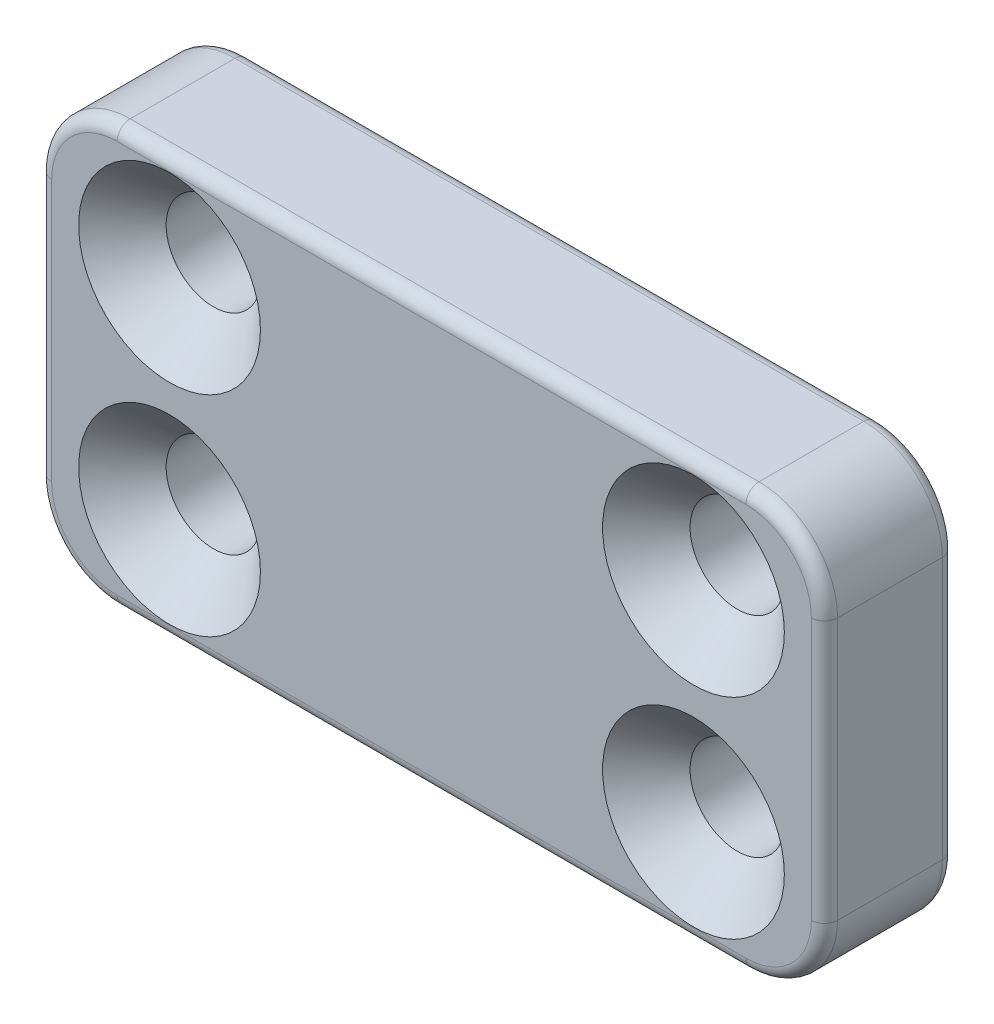
ISO-10303-21;
HEADER;
FILE_DESCRIPTION(('STEP AP214'),'2;1');
FILE_NAME('part.step','',(''),(''),'','','');
FILE_SCHEMA(('AUTOMOTIVE_DESIGN { 1 0 10303 214 1 1 1 1 }'));
ENDSEC;
DATA;
#1=APPLICATION_CONTEXT('core data for automotive mechanical design processes');
#2=APPLICATION_PROTOCOL_DEFINITION('international standard','automotive_design',2000,#1);
#3=PRODUCT_CONTEXT('',#1,'mechanical');
#4=PRODUCT('Part','Part','',(#3));
#5=PRODUCT_RELATED_PRODUCT_CATEGORY('part','',(#4));
#6=PRODUCT_DEFINITION_FORMATION('','',#4);
#7=PRODUCT_DEFINITION_CONTEXT('part definition',#1,'design');
#8=PRODUCT_DEFINITION('design','',#6,#7);
#9=PRODUCT_DEFINITION_SHAPE('','',#8);
#10=(LENGTH_UNIT() NAMED_UNIT(*) SI_UNIT(.MILLI.,.METRE.));
#11=(NAMED_UNIT(*) PLANE_ANGLE_UNIT() SI_UNIT($,.RADIAN.));
#12=(NAMED_UNIT(*) SI_UNIT($,.STERADIAN.) SOLID_ANGLE_UNIT());
#13=UNCERTAINTY_MEASURE_WITH_UNIT(LENGTH_MEASURE(1.E-05),#10,'distance_accuracy_value','');
#14=(GEOMETRIC_REPRESENTATION_CONTEXT(3) GLOBAL_UNCERTAINTY_ASSIGNED_CONTEXT((#13)) GLOBAL_UNIT_ASSIGNED_CONTEXT((#10,
#11,#12)) REPRESENTATION_CONTEXT('',''));
#15=CARTESIAN_POINT('',(0.,0.,0.));
#16=DIRECTION('',(0.,0.,1.));
#17=DIRECTION('',(1.,0.,0.));
#18=AXIS2_PLACEMENT_3D('',#15,#16,#17);
#19=CARTESIAN_POINT('',(0.,0.,5.));
#20=DIRECTION('',(0.,0.,-1.));
#21=DIRECTION('',(-1.,0.,0.));
#22=AXIS2_PLACEMENT_3D('',#19,#20,#21);
#23=PLANE('',#22);
#24=DIRECTION('',(0.,1.,0.));
#25=VECTOR('',#24,1.);
#26=CARTESIAN_POINT('',(29.5,0.,5.));
#27=LINE('',#26,#25);
#28=CARTESIAN_POINT('',(29.5,3.,5.));
#29=VERTEX_POINT('',#28);
#30=CARTESIAN_POINT('',(29.5,13.,5.));
#31=VERTEX_POINT('',#30);
#32=EDGE_CURVE('E173',#29,#31,#27,.T.);
#33=ORIENTED_EDGE('',*,*,#32,.T.);
#34=CARTESIAN_POINT('',(27.,13.,5.));
#35=DIRECTION('',(0.,0.,-1.));
#36=DIRECTION('',(-1.,0.,0.));
#37=AXIS2_PLACEMENT_3D('',#34,#35,#36);
#38=CIRCLE('',#37,2.5);
#39=CARTESIAN_POINT('',(27.,15.5,5.));
#40=VERTEX_POINT('',#39);
#41=EDGE_CURVE('E154',#31,#40,#38,.F.);
#42=ORIENTED_EDGE('',*,*,#41,.T.);
#43=DIRECTION('',(-1.,0.,0.));
#44=VECTOR('',#43,1.);
#45=CARTESIAN_POINT('',(0.,15.5,5.));
#46=LINE('',#45,#44);
#47=CARTESIAN_POINT('',(3.,15.5,5.));
#48=VERTEX_POINT('',#47);
#49=EDGE_CURVE('E162',#40,#48,#46,.T.);
#50=ORIENTED_EDGE('',*,*,#49,.T.);
#51=CARTESIAN_POINT('',(3.,13.,5.));
#52=DIRECTION('',(0.,0.,-1.));
#53=DIRECTION('',(-1.,0.,0.));
#54=AXIS2_PLACEMENT_3D('',#51,#52,#53);
#55=CIRCLE('',#54,2.5);
#56=CARTESIAN_POINT('',(0.5,13.,5.));
#57=VERTEX_POINT('',#56);
#58=EDGE_CURVE('E168',#48,#57,#55,.F.);
#59=ORIENTED_EDGE('',*,*,#58,.T.);
#60=DIRECTION('',(0.,-1.,0.));
#61=VECTOR('',#60,1.);
#62=CARTESIAN_POINT('',(0.5,0.,5.));
#63=LINE('',#62,#61);
#64=CARTESIAN_POINT('',(0.5,3.,5.));
#65=VERTEX_POINT('',#64);
#66=EDGE_CURVE('E305',#57,#65,#63,.T.);
#67=ORIENTED_EDGE('',*,*,#66,.T.);
#68=CARTESIAN_POINT('',(3.,3.,5.));
#69=DIRECTION('',(0.,0.,-1.));
#70=DIRECTION('',(-1.,0.,0.));
#71=AXIS2_PLACEMENT_3D('',#68,#69,#70);
#72=CIRCLE('',#71,2.5);
#73=CARTESIAN_POINT('',(3.,0.5,5.));
#74=VERTEX_POINT('',#73);
#75=EDGE_CURVE('E307',#65,#74,#72,.F.);
#76=ORIENTED_EDGE('',*,*,#75,.T.);
#77=DIRECTION('',(1.,0.,0.));
#78=VECTOR('',#77,1.);
#79=CARTESIAN_POINT('',(0.,0.5,5.));
#80=LINE('',#79,#78);
#81=CARTESIAN_POINT('',(27.,0.5,5.));
#82=VERTEX_POINT('',#81);
#83=EDGE_CURVE('E309',#74,#82,#80,.T.);
#84=ORIENTED_EDGE('',*,*,#83,.T.);
#85=CARTESIAN_POINT('',(27.,3.,5.));
#86=DIRECTION('',(0.,0.,-1.));
#87=DIRECTION('',(-1.,0.,0.));
#88=AXIS2_PLACEMENT_3D('',#85,#86,#87);
#89=CIRCLE('',#88,2.5);
#90=EDGE_CURVE('E179',#82,#29,#89,.F.);
#91=ORIENTED_EDGE('',*,*,#90,.T.);
#92=EDGE_LOOP('',(#33,#42,#50,#59,#67,#76,#84,#91));
#93=FACE_BOUND('',#92,.T.);
#94=CARTESIAN_POINT('',(5.00000000000008,4.,5.));
#95=DIRECTION('',(0.,0.,1.));
#96=DIRECTION('',(1.,0.,0.));
#97=AXIS2_PLACEMENT_3D('',#94,#95,#96);
#98=CIRCLE('',#97,3.47);
#99=CARTESIAN_POINT('',(8.47000000000009,4.,5.));
#100=VERTEX_POINT('',#99);
#101=EDGE_CURVE('E336',#100,#100,#98,.T.);
#102=ORIENTED_EDGE('',*,*,#101,.F.);
#103=EDGE_LOOP('',(#102));
#104=FACE_BOUND('',#103,.T.);
#105=CARTESIAN_POINT('',(25.0000000000001,4.,5.));
#106=DIRECTION('',(0.,0.,1.));
#107=DIRECTION('',(1.,0.,0.));
#108=AXIS2_PLACEMENT_3D('',#105,#106,#107);
#109=CIRCLE('',#108,3.47);
#110=CARTESIAN_POINT('',(28.4700000000001,4.,5.));
#111=VERTEX_POINT('',#110);
#112=EDGE_CURVE('E345',#111,#111,#109,.T.);
#113=ORIENTED_EDGE('',*,*,#112,.F.);
#114=EDGE_LOOP('',(#113));
#115=FACE_BOUND('',#114,.T.);
#116=CARTESIAN_POINT('',(25.,12.,5.));
#117=DIRECTION('',(0.,0.,1.));
#118=DIRECTION('',(1.,0.,0.));
#119=AXIS2_PLACEMENT_3D('',#116,#117,#118);
#120=CIRCLE('',#119,3.47);
#121=CARTESIAN_POINT('',(28.47,12.,5.));
#122=VERTEX_POINT('',#121);
#123=EDGE_CURVE('E354',#122,#122,#120,.T.);
#124=ORIENTED_EDGE('',*,*,#123,.F.);
#125=EDGE_LOOP('',(#124));
#126=FACE_BOUND('',#125,.T.);
#127=CARTESIAN_POINT('',(5.,12.,5.));
#128=DIRECTION('',(0.,0.,1.));
#129=DIRECTION('',(1.,0.,0.));
#130=AXIS2_PLACEMENT_3D('',#127,#128,#129);
#131=CIRCLE('',#130,3.47);
#132=CARTESIAN_POINT('',(8.47,12.,5.));
#133=VERTEX_POINT('',#132);
#134=EDGE_CURVE('E241',#133,#133,#131,.T.);
#135=ORIENTED_EDGE('',*,*,#134,.F.);
#136=EDGE_LOOP('',(#135));
#137=FACE_BOUND('',#136,.T.);
#138=ADVANCED_FACE('F33',(#93,#104,#115,#126,#137),#23,.F.);
#139=CARTESIAN_POINT('',(0.,0.,5.));
#140=DIRECTION('',(1.,0.,0.));
#141=DIRECTION('',(0.,0.,-1.));
#142=AXIS2_PLACEMENT_3D('',#139,#140,#141);
#143=PLANE('',#142);
#144=DIRECTION('',(0.,0.,-1.));
#145=VECTOR('',#144,1.);
#146=CARTESIAN_POINT('',(0.,3.,5.));
#147=LINE('',#146,#145);
#148=CARTESIAN_POINT('',(0.,3.,0.5));
#149=VERTEX_POINT('',#148);
#150=CARTESIAN_POINT('',(0.,3.,4.5));
#151=VERTEX_POINT('',#150);
#152=EDGE_CURVE('E169',#149,#151,#147,.F.);
#153=ORIENTED_EDGE('',*,*,#152,.T.);
#154=DIRECTION('',(0.,-1.,0.));
#155=VECTOR('',#154,1.);
#156=CARTESIAN_POINT('',(0.,0.,4.5));
#157=LINE('',#156,#155);
#158=CARTESIAN_POINT('',(0.,13.,4.5));
#159=VERTEX_POINT('',#158);
#160=EDGE_CURVE('E202',#151,#159,#157,.F.);
#161=ORIENTED_EDGE('',*,*,#160,.T.);
#162=DIRECTION('',(0.,0.,-1.));
#163=VECTOR('',#162,1.);
#164=CARTESIAN_POINT('',(0.,13.,5.));
#165=LINE('',#164,#163);
#166=CARTESIAN_POINT('',(0.,13.,0.5));
#167=VERTEX_POINT('',#166);
#168=EDGE_CURVE('E300',#159,#167,#165,.T.);
#169=ORIENTED_EDGE('',*,*,#168,.T.);
#170=DIRECTION('',(0.,-1.,0.));
#171=VECTOR('',#170,1.);
#172=CARTESIAN_POINT('',(0.,3.,0.5));
#173=LINE('',#172,#171);
#174=EDGE_CURVE('E200',#167,#149,#173,.T.);
#175=ORIENTED_EDGE('',*,*,#174,.T.);
#176=EDGE_LOOP('',(#153,#161,#169,#175));
#177=FACE_BOUND('',#176,.T.);
#178=ADVANCED_FACE('F369',(#177),#143,.F.);
#179=CARTESIAN_POINT('',(0.,0.,5.));
#180=DIRECTION('',(0.,1.,0.));
#181=DIRECTION('',(0.,0.,1.));
#182=AXIS2_PLACEMENT_3D('',#179,#180,#181);
#183=PLANE('',#182);
#184=DIRECTION('',(0.,0.,-1.));
#185=VECTOR('',#184,1.);
#186=CARTESIAN_POINT('',(27.,0.,5.));
#187=LINE('',#186,#185);
#188=CARTESIAN_POINT('',(27.,0.,0.5));
#189=VERTEX_POINT('',#188);
#190=CARTESIAN_POINT('',(27.,0.,4.5));
#191=VERTEX_POINT('',#190);
#192=EDGE_CURVE('E285',#189,#191,#187,.F.);
#193=ORIENTED_EDGE('',*,*,#192,.T.);
#194=DIRECTION('',(1.,0.,0.));
#195=VECTOR('',#194,1.);
#196=CARTESIAN_POINT('',(0.,0.,4.5));
#197=LINE('',#196,#195);
#198=CARTESIAN_POINT('',(3.,0.,4.5));
#199=VERTEX_POINT('',#198);
#200=EDGE_CURVE('E194',#191,#199,#197,.F.);
#201=ORIENTED_EDGE('',*,*,#200,.T.);
#202=DIRECTION('',(0.,0.,-1.));
#203=VECTOR('',#202,1.);
#204=CARTESIAN_POINT('',(3.,0.,5.));
#205=LINE('',#204,#203);
#206=CARTESIAN_POINT('',(3.,0.,0.5));
#207=VERTEX_POINT('',#206);
#208=EDGE_CURVE('E277',#199,#207,#205,.T.);
#209=ORIENTED_EDGE('',*,*,#208,.T.);
#210=DIRECTION('',(1.,0.,0.));
#211=VECTOR('',#210,1.);
#212=CARTESIAN_POINT('',(27.,0.,0.5));
#213=LINE('',#212,#211);
#214=EDGE_CURVE('E192',#207,#189,#213,.T.);
#215=ORIENTED_EDGE('',*,*,#214,.T.);
#216=EDGE_LOOP('',(#193,#201,#209,#215));
#217=FACE_BOUND('',#216,.T.);
#218=ADVANCED_FACE('F282',(#217),#183,.F.);
#219=CARTESIAN_POINT('',(30.,0.,5.));
#220=DIRECTION('',(-1.,0.,0.));
#221=DIRECTION('',(0.,0.,1.));
#222=AXIS2_PLACEMENT_3D('',#219,#220,#221);
#223=PLANE('',#222);
#224=DIRECTION('',(0.,0.,-1.));
#225=VECTOR('',#224,1.);
#226=CARTESIAN_POINT('',(30.,13.,5.));
#227=LINE('',#226,#225);
#228=CARTESIAN_POINT('',(30.,13.,0.5));
#229=VERTEX_POINT('',#228);
#230=CARTESIAN_POINT('',(30.,13.,4.5));
#231=VERTEX_POINT('',#230);
#232=EDGE_CURVE('E291',#229,#231,#227,.F.);
#233=ORIENTED_EDGE('',*,*,#232,.T.);
#234=DIRECTION('',(0.,1.,0.));
#235=VECTOR('',#234,1.);
#236=CARTESIAN_POINT('',(30.,0.,4.5));
#237=LINE('',#236,#235);
#238=CARTESIAN_POINT('',(30.,3.,4.5));
#239=VERTEX_POINT('',#238);
#240=EDGE_CURVE('E186',#231,#239,#237,.F.);
#241=ORIENTED_EDGE('',*,*,#240,.T.);
#242=DIRECTION('',(0.,0.,-1.));
#243=VECTOR('',#242,1.);
#244=CARTESIAN_POINT('',(30.,3.,5.));
#245=LINE('',#244,#243);
#246=CARTESIAN_POINT('',(30.,3.,0.5));
#247=VERTEX_POINT('',#246);
#248=EDGE_CURVE('E286',#239,#247,#245,.T.);
#249=ORIENTED_EDGE('',*,*,#248,.T.);
#250=DIRECTION('',(0.,1.,0.));
#251=VECTOR('',#250,1.);
#252=CARTESIAN_POINT('',(30.,13.,0.5));
#253=LINE('',#252,#251);
#254=EDGE_CURVE('E184',#247,#229,#253,.T.);
#255=ORIENTED_EDGE('',*,*,#254,.T.);
#256=EDGE_LOOP('',(#233,#241,#249,#255));
#257=FACE_BOUND('',#256,.T.);
#258=ADVANCED_FACE('F327',(#257),#223,.F.);
#259=CARTESIAN_POINT('',(0.,16.,5.));
#260=DIRECTION('',(0.,-1.,0.));
#261=DIRECTION('',(0.,0.,-1.));
#262=AXIS2_PLACEMENT_3D('',#259,#260,#261);
#263=PLANE('',#262);
#264=DIRECTION('',(0.,0.,-1.));
#265=VECTOR('',#264,1.);
#266=CARTESIAN_POINT('',(3.,16.,5.));
#267=LINE('',#266,#265);
#268=CARTESIAN_POINT('',(3.,16.,0.5));
#269=VERTEX_POINT('',#268);
#270=CARTESIAN_POINT('',(3.,16.,4.5));
#271=VERTEX_POINT('',#270);
#272=EDGE_CURVE('E288',#269,#271,#267,.F.);
#273=ORIENTED_EDGE('',*,*,#272,.T.);
#274=DIRECTION('',(-1.,0.,0.));
#275=VECTOR('',#274,1.);
#276=CARTESIAN_POINT('',(0.,16.,4.5));
#277=LINE('',#276,#275);
#278=CARTESIAN_POINT('',(27.,16.,4.5));
#279=VERTEX_POINT('',#278);
#280=EDGE_CURVE('E11',#271,#279,#277,.F.);
#281=ORIENTED_EDGE('',*,*,#280,.T.);
#282=DIRECTION('',(0.,0.,-1.));
#283=VECTOR('',#282,1.);
#284=CARTESIAN_POINT('',(27.,16.,5.));
#285=LINE('',#284,#283);
#286=CARTESIAN_POINT('',(27.,16.,0.5));
#287=VERTEX_POINT('',#286);
#288=EDGE_CURVE('E297',#279,#287,#285,.T.);
#289=ORIENTED_EDGE('',*,*,#288,.T.);
#290=DIRECTION('',(-1.,0.,0.));
#291=VECTOR('',#290,1.);
#292=CARTESIAN_POINT('',(3.,16.,0.5));
#293=LINE('',#292,#291);
#294=EDGE_CURVE('E42',#287,#269,#293,.T.);
#295=ORIENTED_EDGE('',*,*,#294,.T.);
#296=EDGE_LOOP('',(#273,#281,#289,#295));
#297=FACE_BOUND('',#296,.T.);
#298=ADVANCED_FACE('F383',(#297),#263,.F.);
#299=CARTESIAN_POINT('',(0.,0.,0.));
#300=DIRECTION('',(0.,0.,-1.));
#301=DIRECTION('',(-1.,0.,0.));
#302=AXIS2_PLACEMENT_3D('',#299,#300,#301);
#303=PLANE('',#302);
#304=DIRECTION('',(-1.,0.,0.));
#305=VECTOR('',#304,1.);
#306=CARTESIAN_POINT('',(27.,15.5,0.));
#307=LINE('',#306,#305);
#308=CARTESIAN_POINT('',(3.,15.5,0.));
#309=VERTEX_POINT('',#308);
#310=CARTESIAN_POINT('',(27.,15.5,0.));
#311=VERTEX_POINT('',#310);
#312=EDGE_CURVE('E208',#309,#311,#307,.F.);
#313=ORIENTED_EDGE('',*,*,#312,.T.);
#314=CARTESIAN_POINT('',(27.,13.,0.));
#315=DIRECTION('',(0.,0.,-1.));
#316=DIRECTION('',(-1.,0.,0.));
#317=AXIS2_PLACEMENT_3D('',#314,#315,#316);
#318=CIRCLE('',#317,2.5);
#319=CARTESIAN_POINT('',(29.5,13.,0.));
#320=VERTEX_POINT('',#319);
#321=EDGE_CURVE('E221',#311,#320,#318,.T.);
#322=ORIENTED_EDGE('',*,*,#321,.T.);
#323=DIRECTION('',(0.,1.,0.));
#324=VECTOR('',#323,1.);
#325=CARTESIAN_POINT('',(29.5,3.,0.));
#326=LINE('',#325,#324);
#327=CARTESIAN_POINT('',(29.5,3.,0.));
#328=VERTEX_POINT('',#327);
#329=EDGE_CURVE('E57',#320,#328,#326,.F.);
#330=ORIENTED_EDGE('',*,*,#329,.T.);
#331=CARTESIAN_POINT('',(27.,3.,0.));
#332=DIRECTION('',(0.,0.,-1.));
#333=DIRECTION('',(-1.,0.,0.));
#334=AXIS2_PLACEMENT_3D('',#331,#332,#333);
#335=CIRCLE('',#334,2.5);
#336=CARTESIAN_POINT('',(27.,0.5,0.));
#337=VERTEX_POINT('',#336);
#338=EDGE_CURVE('E218',#328,#337,#335,.T.);
#339=ORIENTED_EDGE('',*,*,#338,.T.);
#340=DIRECTION('',(1.,0.,0.));
#341=VECTOR('',#340,1.);
#342=CARTESIAN_POINT('',(3.,0.5,0.));
#343=LINE('',#342,#341);
#344=CARTESIAN_POINT('',(3.,0.5,0.));
#345=VERTEX_POINT('',#344);
#346=EDGE_CURVE('E216',#337,#345,#343,.F.);
#347=ORIENTED_EDGE('',*,*,#346,.T.);
#348=CARTESIAN_POINT('',(3.,3.,0.));
#349=DIRECTION('',(0.,0.,-1.));
#350=DIRECTION('',(-1.,0.,0.));
#351=AXIS2_PLACEMENT_3D('',#348,#349,#350);
#352=CIRCLE('',#351,2.5);
#353=CARTESIAN_POINT('',(0.5,3.,0.));
#354=VERTEX_POINT('',#353);
#355=EDGE_CURVE('E214',#345,#354,#352,.T.);
#356=ORIENTED_EDGE('',*,*,#355,.T.);
#357=DIRECTION('',(0.,-1.,0.));
#358=VECTOR('',#357,1.);
#359=CARTESIAN_POINT('',(0.5,13.,0.));
#360=LINE('',#359,#358);
#361=CARTESIAN_POINT('',(0.5,13.,0.));
#362=VERTEX_POINT('',#361);
#363=EDGE_CURVE('E212',#354,#362,#360,.F.);
#364=ORIENTED_EDGE('',*,*,#363,.T.);
#365=CARTESIAN_POINT('',(3.,13.,0.));
#366=DIRECTION('',(0.,0.,-1.));
#367=DIRECTION('',(-1.,0.,0.));
#368=AXIS2_PLACEMENT_3D('',#365,#366,#367);
#369=CIRCLE('',#368,2.5);
#370=EDGE_CURVE('E210',#362,#309,#369,.T.);
#371=ORIENTED_EDGE('',*,*,#370,.T.);
#372=EDGE_LOOP('',(#313,#322,#330,#339,#347,#356,#364,#371));
#373=FACE_BOUND('',#372,.T.);
#374=CARTESIAN_POINT('',(5.,12.,0.));
#375=DIRECTION('',(0.,0.,-1.));
#376=DIRECTION('',(-1.,0.,0.));
#377=AXIS2_PLACEMENT_3D('',#374,#375,#376);
#378=CIRCLE('',#377,1.8);
#379=CARTESIAN_POINT('',(3.2,12.,0.));
#380=VERTEX_POINT('',#379);
#381=EDGE_CURVE('E357',#380,#380,#378,.T.);
#382=ORIENTED_EDGE('',*,*,#381,.F.);
#383=EDGE_LOOP('',(#382));
#384=FACE_BOUND('',#383,.T.);
#385=CARTESIAN_POINT('',(25.,12.,0.));
#386=DIRECTION('',(0.,0.,-1.));
#387=DIRECTION('',(-1.,0.,0.));
#388=AXIS2_PLACEMENT_3D('',#385,#386,#387);
#389=CIRCLE('',#388,1.8);
#390=CARTESIAN_POINT('',(23.2,12.,0.));
#391=VERTEX_POINT('',#390);
#392=EDGE_CURVE('E348',#391,#391,#389,.T.);
#393=ORIENTED_EDGE('',*,*,#392,.F.);
#394=EDGE_LOOP('',(#393));
#395=FACE_BOUND('',#394,.T.);
#396=CARTESIAN_POINT('',(25.0000000000001,4.,0.));
#397=DIRECTION('',(0.,0.,-1.));
#398=DIRECTION('',(-1.,0.,0.));
#399=AXIS2_PLACEMENT_3D('',#396,#397,#398);
#400=CIRCLE('',#399,1.8);
#401=CARTESIAN_POINT('',(23.2000000000001,4.,0.));
#402=VERTEX_POINT('',#401);
#403=EDGE_CURVE('E339',#402,#402,#400,.T.);
#404=ORIENTED_EDGE('',*,*,#403,.F.);
#405=EDGE_LOOP('',(#404));
#406=FACE_BOUND('',#405,.T.);
#407=CARTESIAN_POINT('',(5.00000000000008,4.,0.));
#408=DIRECTION('',(0.,0.,-1.));
#409=DIRECTION('',(-1.,0.,0.));
#410=AXIS2_PLACEMENT_3D('',#407,#408,#409);
#411=CIRCLE('',#410,1.8);
#412=CARTESIAN_POINT('',(3.20000000000008,4.,0.));
#413=VERTEX_POINT('',#412);
#414=EDGE_CURVE('E329',#413,#413,#411,.T.);
#415=ORIENTED_EDGE('',*,*,#414,.F.);
#416=EDGE_LOOP('',(#415));
#417=FACE_BOUND('',#416,.T.);
#418=ADVANCED_FACE('F380',(#373,#384,#395,#406,#417),#303,.T.);
#419=CARTESIAN_POINT('',(5.00000000000008,4.,5.));
#420=DIRECTION('',(0.,0.,1.));
#421=DIRECTION('',(1.,0.,0.));
#422=AXIS2_PLACEMENT_3D('',#419,#420,#421);
#423=CYLINDRICAL_SURFACE('',#422,1.8);
#424=CARTESIAN_POINT('',(5.00000000000008,4.,3.33));
#425=DIRECTION('',(0.,0.,1.));
#426=DIRECTION('',(1.,0.,0.));
#427=AXIS2_PLACEMENT_3D('',#424,#425,#426);
#428=CIRCLE('',#427,1.8);
#429=CARTESIAN_POINT('',(6.80000000000008,4.,3.33));
#430=VERTEX_POINT('',#429);
#431=EDGE_CURVE('E331',#430,#430,#428,.T.);
#432=ORIENTED_EDGE('',*,*,#431,.T.);
#433=EDGE_LOOP('',(#432));
#434=FACE_BOUND('',#433,.T.);
#435=ORIENTED_EDGE('',*,*,#414,.T.);
#436=EDGE_LOOP('',(#435));
#437=FACE_BOUND('',#436,.T.);
#438=ADVANCED_FACE('F378',(#434,#437),#423,.F.);
#439=CARTESIAN_POINT('',(5.00000000000008,4.,5.));
#440=DIRECTION('',(0.,0.,1.));
#441=DIRECTION('',(1.,0.,0.));
#442=AXIS2_PLACEMENT_3D('',#439,#440,#441);
#443=CONICAL_SURFACE('',#442,3.47,0.785398163397449);
#444=ORIENTED_EDGE('',*,*,#431,.F.);
#445=EDGE_LOOP('',(#444));
#446=FACE_BOUND('',#445,.T.);
#447=ORIENTED_EDGE('',*,*,#101,.T.);
#448=EDGE_LOOP('',(#447));
#449=FACE_BOUND('',#448,.T.);
#450=ADVANCED_FACE('F549',(#446,#449),#443,.F.);
#451=CARTESIAN_POINT('',(25.0000000000001,4.,5.));
#452=DIRECTION('',(0.,0.,1.));
#453=DIRECTION('',(1.,0.,0.));
#454=AXIS2_PLACEMENT_3D('',#451,#452,#453);
#455=CYLINDRICAL_SURFACE('',#454,1.8);
#456=CARTESIAN_POINT('',(25.0000000000001,4.,3.33));
#457=DIRECTION('',(0.,0.,1.));
#458=DIRECTION('',(1.,0.,0.));
#459=AXIS2_PLACEMENT_3D('',#456,#457,#458);
#460=CIRCLE('',#459,1.8);
#461=CARTESIAN_POINT('',(26.8000000000001,4.,3.33));
#462=VERTEX_POINT('',#461);
#463=EDGE_CURVE('E342',#462,#462,#460,.T.);
#464=ORIENTED_EDGE('',*,*,#463,.T.);
#465=EDGE_LOOP('',(#464));
#466=FACE_BOUND('',#465,.T.);
#467=ORIENTED_EDGE('',*,*,#403,.T.);
#468=EDGE_LOOP('',(#467));
#469=FACE_BOUND('',#468,.T.);
#470=ADVANCED_FACE('F541',(#466,#469),#455,.F.);
#471=CARTESIAN_POINT('',(25.0000000000001,4.,5.));
#472=DIRECTION('',(0.,0.,1.));
#473=DIRECTION('',(1.,0.,0.));
#474=AXIS2_PLACEMENT_3D('',#471,#472,#473);
#475=CONICAL_SURFACE('',#474,3.47,0.785398163397449);
#476=ORIENTED_EDGE('',*,*,#463,.F.);
#477=EDGE_LOOP('',(#476));
#478=FACE_BOUND('',#477,.T.);
#479=ORIENTED_EDGE('',*,*,#112,.T.);
#480=EDGE_LOOP('',(#479));
#481=FACE_BOUND('',#480,.T.);
#482=ADVANCED_FACE('F533',(#478,#481),#475,.F.);
#483=CARTESIAN_POINT('',(25.,12.,5.));
#484=DIRECTION('',(0.,0.,1.));
#485=DIRECTION('',(1.,0.,0.));
#486=AXIS2_PLACEMENT_3D('',#483,#484,#485);
#487=CYLINDRICAL_SURFACE('',#486,1.8);
#488=CARTESIAN_POINT('',(25.,12.,3.33));
#489=DIRECTION('',(0.,0.,1.));
#490=DIRECTION('',(1.,0.,0.));
#491=AXIS2_PLACEMENT_3D('',#488,#489,#490);
#492=CIRCLE('',#491,1.8);
#493=CARTESIAN_POINT('',(26.8,12.,3.33));
#494=VERTEX_POINT('',#493);
#495=EDGE_CURVE('E351',#494,#494,#492,.T.);
#496=ORIENTED_EDGE('',*,*,#495,.T.);
#497=EDGE_LOOP('',(#496));
#498=FACE_BOUND('',#497,.T.);
#499=ORIENTED_EDGE('',*,*,#392,.T.);
#500=EDGE_LOOP('',(#499));
#501=FACE_BOUND('',#500,.T.);
#502=ADVANCED_FACE('F525',(#498,#501),#487,.F.);
#503=CARTESIAN_POINT('',(25.,12.,5.));
#504=DIRECTION('',(0.,0.,1.));
#505=DIRECTION('',(1.,0.,0.));
#506=AXIS2_PLACEMENT_3D('',#503,#504,#505);
#507=CONICAL_SURFACE('',#506,3.47,0.785398163397449);
#508=ORIENTED_EDGE('',*,*,#495,.F.);
#509=EDGE_LOOP('',(#508));
#510=FACE_BOUND('',#509,.T.);
#511=ORIENTED_EDGE('',*,*,#123,.T.);
#512=EDGE_LOOP('',(#511));
#513=FACE_BOUND('',#512,.T.);
#514=ADVANCED_FACE('F517',(#510,#513),#507,.F.);
#515=CARTESIAN_POINT('',(5.,12.,5.));
#516=DIRECTION('',(0.,0.,1.));
#517=DIRECTION('',(1.,0.,0.));
#518=AXIS2_PLACEMENT_3D('',#515,#516,#517);
#519=CYLINDRICAL_SURFACE('',#518,1.8);
#520=CARTESIAN_POINT('',(5.,12.,3.33));
#521=DIRECTION('',(0.,0.,1.));
#522=DIRECTION('',(1.,0.,0.));
#523=AXIS2_PLACEMENT_3D('',#520,#521,#522);
#524=CIRCLE('',#523,1.8);
#525=CARTESIAN_POINT('',(6.8,12.,3.33));
#526=VERTEX_POINT('',#525);
#527=EDGE_CURVE('E360',#526,#526,#524,.T.);
#528=ORIENTED_EDGE('',*,*,#527,.T.);
#529=EDGE_LOOP('',(#528));
#530=FACE_BOUND('',#529,.T.);
#531=ORIENTED_EDGE('',*,*,#381,.T.);
#532=EDGE_LOOP('',(#531));
#533=FACE_BOUND('',#532,.T.);
#534=ADVANCED_FACE('F509',(#530,#533),#519,.F.);
#535=CARTESIAN_POINT('',(5.,12.,5.));
#536=DIRECTION('',(0.,0.,1.));
#537=DIRECTION('',(1.,0.,0.));
#538=AXIS2_PLACEMENT_3D('',#535,#536,#537);
#539=CONICAL_SURFACE('',#538,3.47,0.785398163397449);
#540=ORIENTED_EDGE('',*,*,#527,.F.);
#541=EDGE_LOOP('',(#540));
#542=FACE_BOUND('',#541,.T.);
#543=ORIENTED_EDGE('',*,*,#134,.T.);
#544=EDGE_LOOP('',(#543));
#545=FACE_BOUND('',#544,.T.);
#546=ADVANCED_FACE('F366',(#542,#545),#539,.F.);
#547=CARTESIAN_POINT('',(27.,3.,5.));
#548=DIRECTION('',(0.,0.,-1.));
#549=DIRECTION('',(-1.,0.,0.));
#550=AXIS2_PLACEMENT_3D('',#547,#548,#549);
#551=CYLINDRICAL_SURFACE('',#550,3.);
#552=ORIENTED_EDGE('',*,*,#248,.F.);
#553=CARTESIAN_POINT('',(27.,3.,4.5));
#554=DIRECTION('',(0.,0.,-1.));
#555=DIRECTION('',(-1.,0.,0.));
#556=AXIS2_PLACEMENT_3D('',#553,#554,#555);
#557=CIRCLE('',#556,3.);
#558=EDGE_CURVE('E190',#239,#191,#557,.T.);
#559=ORIENTED_EDGE('',*,*,#558,.T.);
#560=ORIENTED_EDGE('',*,*,#192,.F.);
#561=CARTESIAN_POINT('',(27.,3.,0.5));
#562=DIRECTION('',(0.,0.,-1.));
#563=DIRECTION('',(-1.,0.,0.));
#564=AXIS2_PLACEMENT_3D('',#561,#562,#563);
#565=CIRCLE('',#564,3.);
#566=EDGE_CURVE('E188',#189,#247,#565,.F.);
#567=ORIENTED_EDGE('',*,*,#566,.T.);
#568=EDGE_LOOP('',(#552,#559,#560,#567));
#569=FACE_BOUND('',#568,.T.);
#570=ADVANCED_FACE('F391',(#569),#551,.T.);
#571=CARTESIAN_POINT('',(27.,13.,5.));
#572=DIRECTION('',(0.,0.,-1.));
#573=DIRECTION('',(-1.,0.,0.));
#574=AXIS2_PLACEMENT_3D('',#571,#572,#573);
#575=CYLINDRICAL_SURFACE('',#574,3.);
#576=ORIENTED_EDGE('',*,*,#288,.F.);
#577=CARTESIAN_POINT('',(27.,13.,4.5));
#578=DIRECTION('',(0.,0.,-1.));
#579=DIRECTION('',(-1.,0.,0.));
#580=AXIS2_PLACEMENT_3D('',#577,#578,#579);
#581=CIRCLE('',#580,3.);
#582=EDGE_CURVE('E156',#279,#231,#581,.T.);
#583=ORIENTED_EDGE('',*,*,#582,.T.);
#584=ORIENTED_EDGE('',*,*,#232,.F.);
#585=CARTESIAN_POINT('',(27.,13.,0.5));
#586=DIRECTION('',(0.,0.,-1.));
#587=DIRECTION('',(-1.,0.,0.));
#588=AXIS2_PLACEMENT_3D('',#585,#586,#587);
#589=CIRCLE('',#588,3.);
#590=EDGE_CURVE('E175',#229,#287,#589,.F.);
#591=ORIENTED_EDGE('',*,*,#590,.T.);
#592=EDGE_LOOP('',(#576,#583,#584,#591));
#593=FACE_BOUND('',#592,.T.);
#594=ADVANCED_FACE('F326',(#593),#575,.T.);
#595=CARTESIAN_POINT('',(3.,3.,5.));
#596=DIRECTION('',(0.,0.,-1.));
#597=DIRECTION('',(-1.,0.,0.));
#598=AXIS2_PLACEMENT_3D('',#595,#596,#597);
#599=CYLINDRICAL_SURFACE('',#598,3.);
#600=ORIENTED_EDGE('',*,*,#208,.F.);
#601=CARTESIAN_POINT('',(3.,3.,4.5));
#602=DIRECTION('',(0.,0.,-1.));
#603=DIRECTION('',(-1.,0.,0.));
#604=AXIS2_PLACEMENT_3D('',#601,#602,#603);
#605=CIRCLE('',#604,3.);
#606=EDGE_CURVE('E198',#199,#151,#605,.T.);
#607=ORIENTED_EDGE('',*,*,#606,.T.);
#608=ORIENTED_EDGE('',*,*,#152,.F.);
#609=CARTESIAN_POINT('',(3.,3.,0.5));
#610=DIRECTION('',(0.,0.,-1.));
#611=DIRECTION('',(-1.,0.,0.));
#612=AXIS2_PLACEMENT_3D('',#609,#610,#611);
#613=CIRCLE('',#612,3.);
#614=EDGE_CURVE('E196',#149,#207,#613,.F.);
#615=ORIENTED_EDGE('',*,*,#614,.T.);
#616=EDGE_LOOP('',(#600,#607,#608,#615));
#617=FACE_BOUND('',#616,.T.);
#618=ADVANCED_FACE('F276',(#617),#599,.T.);
#619=CARTESIAN_POINT('',(3.,13.,5.));
#620=DIRECTION('',(0.,0.,-1.));
#621=DIRECTION('',(-1.,0.,0.));
#622=AXIS2_PLACEMENT_3D('',#619,#620,#621);
#623=CYLINDRICAL_SURFACE('',#622,3.);
#624=ORIENTED_EDGE('',*,*,#168,.F.);
#625=CARTESIAN_POINT('',(3.,13.,4.5));
#626=DIRECTION('',(0.,0.,-1.));
#627=DIRECTION('',(-1.,0.,0.));
#628=AXIS2_PLACEMENT_3D('',#625,#626,#627);
#629=CIRCLE('',#628,3.);
#630=EDGE_CURVE('E206',#159,#271,#629,.T.);
#631=ORIENTED_EDGE('',*,*,#630,.T.);
#632=ORIENTED_EDGE('',*,*,#272,.F.);
#633=CARTESIAN_POINT('',(3.,13.,0.5));
#634=DIRECTION('',(0.,0.,-1.));
#635=DIRECTION('',(-1.,0.,0.));
#636=AXIS2_PLACEMENT_3D('',#633,#634,#635);
#637=CIRCLE('',#636,3.);
#638=EDGE_CURVE('E204',#269,#167,#637,.F.);
#639=ORIENTED_EDGE('',*,*,#638,.T.);
#640=EDGE_LOOP('',(#624,#631,#632,#639));
#641=FACE_BOUND('',#640,.T.);
#642=ADVANCED_FACE('F399',(#641),#623,.T.);
#643=CARTESIAN_POINT('',(3.,3.,4.5));
#644=DIRECTION('',(0.,0.,-1.));
#645=DIRECTION('',(-1.,0.,0.));
#646=AXIS2_PLACEMENT_3D('',#643,#644,#645);
#647=TOROIDAL_SURFACE('',#646,2.5,0.5);
#648=CARTESIAN_POINT('',(0.5,3.,4.5));
#649=DIRECTION('',(0.,1.,0.));
#650=DIRECTION('',(0.,0.,1.));
#651=AXIS2_PLACEMENT_3D('',#648,#649,#650);
#652=CIRCLE('',#651,0.5);
#653=EDGE_CURVE('E235',#151,#65,#652,.T.);
#654=ORIENTED_EDGE('',*,*,#653,.F.);
#655=ORIENTED_EDGE('',*,*,#606,.F.);
#656=CARTESIAN_POINT('',(3.,0.5,4.5));
#657=DIRECTION('',(1.,0.,0.));
#658=DIRECTION('',(0.,0.,-1.));
#659=AXIS2_PLACEMENT_3D('',#656,#657,#658);
#660=CIRCLE('',#659,0.5);
#661=EDGE_CURVE('E238',#74,#199,#660,.T.);
#662=ORIENTED_EDGE('',*,*,#661,.F.);
#663=ORIENTED_EDGE('',*,*,#75,.F.);
#664=EDGE_LOOP('',(#654,#655,#662,#663));
#665=FACE_BOUND('',#664,.T.);
#666=ADVANCED_FACE('F402',(#665),#647,.T.);
#667=CARTESIAN_POINT('',(0.,0.5,4.5));
#668=DIRECTION('',(1.,0.,0.));
#669=DIRECTION('',(0.,0.,-1.));
#670=AXIS2_PLACEMENT_3D('',#667,#668,#669);
#671=CYLINDRICAL_SURFACE('',#670,0.5);
#672=ORIENTED_EDGE('',*,*,#661,.T.);
#673=ORIENTED_EDGE('',*,*,#200,.F.);
#674=CARTESIAN_POINT('',(27.,0.5,4.5));
#675=DIRECTION('',(1.,0.,0.));
#676=DIRECTION('',(0.,0.,-1.));
#677=AXIS2_PLACEMENT_3D('',#674,#675,#676);
#678=CIRCLE('',#677,0.5);
#679=EDGE_CURVE('E232',#82,#191,#678,.T.);
#680=ORIENTED_EDGE('',*,*,#679,.F.);
#681=ORIENTED_EDGE('',*,*,#83,.F.);
#682=EDGE_LOOP('',(#672,#673,#680,#681));
#683=FACE_BOUND('',#682,.T.);
#684=ADVANCED_FACE('F419',(#683),#671,.T.);
#685=CARTESIAN_POINT('',(0.5,0.,4.5));
#686=DIRECTION('',(0.,-1.,0.));
#687=DIRECTION('',(0.,0.,-1.));
#688=AXIS2_PLACEMENT_3D('',#685,#686,#687);
#689=CYLINDRICAL_SURFACE('',#688,0.5);
#690=ORIENTED_EDGE('',*,*,#653,.T.);
#691=ORIENTED_EDGE('',*,*,#66,.F.);
#692=CARTESIAN_POINT('',(0.5,13.,4.5));
#693=DIRECTION('',(0.,1.,0.));
#694=DIRECTION('',(0.,0.,1.));
#695=AXIS2_PLACEMENT_3D('',#692,#693,#694);
#696=CIRCLE('',#695,0.5);
#697=EDGE_CURVE('E229',#159,#57,#696,.T.);
#698=ORIENTED_EDGE('',*,*,#697,.F.);
#699=ORIENTED_EDGE('',*,*,#160,.F.);
#700=EDGE_LOOP('',(#690,#691,#698,#699));
#701=FACE_BOUND('',#700,.T.);
#702=ADVANCED_FACE('F416',(#701),#689,.T.);
#703=CARTESIAN_POINT('',(27.,3.,4.5));
#704=DIRECTION('',(0.,0.,-1.));
#705=DIRECTION('',(-1.,0.,0.));
#706=AXIS2_PLACEMENT_3D('',#703,#704,#705);
#707=TOROIDAL_SURFACE('',#706,2.5,0.5);
#708=ORIENTED_EDGE('',*,*,#679,.T.);
#709=ORIENTED_EDGE('',*,*,#558,.F.);
#710=CARTESIAN_POINT('',(29.5,3.,4.5));
#711=DIRECTION('',(0.,1.,0.));
#712=DIRECTION('',(0.,0.,1.));
#713=AXIS2_PLACEMENT_3D('',#710,#711,#712);
#714=CIRCLE('',#713,0.5);
#715=EDGE_CURVE('E226',#29,#239,#714,.T.);
#716=ORIENTED_EDGE('',*,*,#715,.F.);
#717=ORIENTED_EDGE('',*,*,#90,.F.);
#718=EDGE_LOOP('',(#708,#709,#716,#717));
#719=FACE_BOUND('',#718,.T.);
#720=ADVANCED_FACE('F316',(#719),#707,.T.);
#721=CARTESIAN_POINT('',(3.,13.,4.5));
#722=DIRECTION('',(0.,0.,-1.));
#723=DIRECTION('',(-1.,0.,0.));
#724=AXIS2_PLACEMENT_3D('',#721,#722,#723);
#725=TOROIDAL_SURFACE('',#724,2.5,0.5);
#726=ORIENTED_EDGE('',*,*,#697,.T.);
#727=ORIENTED_EDGE('',*,*,#58,.F.);
#728=CARTESIAN_POINT('',(3.,15.5,4.5));
#729=DIRECTION('',(1.,0.,0.));
#730=DIRECTION('',(0.,0.,-1.));
#731=AXIS2_PLACEMENT_3D('',#728,#729,#730);
#732=CIRCLE('',#731,0.5);
#733=EDGE_CURVE('E165',#271,#48,#732,.T.);
#734=ORIENTED_EDGE('',*,*,#733,.F.);
#735=ORIENTED_EDGE('',*,*,#630,.F.);
#736=EDGE_LOOP('',(#726,#727,#734,#735));
#737=FACE_BOUND('',#736,.T.);
#738=ADVANCED_FACE('F410',(#737),#725,.T.);
#739=CARTESIAN_POINT('',(29.5,0.,4.5));
#740=DIRECTION('',(0.,1.,0.));
#741=DIRECTION('',(0.,0.,1.));
#742=AXIS2_PLACEMENT_3D('',#739,#740,#741);
#743=CYLINDRICAL_SURFACE('',#742,0.5);
#744=ORIENTED_EDGE('',*,*,#715,.T.);
#745=ORIENTED_EDGE('',*,*,#240,.F.);
#746=CARTESIAN_POINT('',(29.5,13.,4.5));
#747=DIRECTION('',(0.,1.,0.));
#748=DIRECTION('',(0.,0.,1.));
#749=AXIS2_PLACEMENT_3D('',#746,#747,#748);
#750=CIRCLE('',#749,0.5);
#751=EDGE_CURVE('E159',#31,#231,#750,.T.);
#752=ORIENTED_EDGE('',*,*,#751,.F.);
#753=ORIENTED_EDGE('',*,*,#32,.F.);
#754=EDGE_LOOP('',(#744,#745,#752,#753));
#755=FACE_BOUND('',#754,.T.);
#756=ADVANCED_FACE('F319',(#755),#743,.T.);
#757=CARTESIAN_POINT('',(0.,15.5,4.5));
#758=DIRECTION('',(-1.,0.,0.));
#759=DIRECTION('',(0.,0.,1.));
#760=AXIS2_PLACEMENT_3D('',#757,#758,#759);
#761=CYLINDRICAL_SURFACE('',#760,0.5);
#762=ORIENTED_EDGE('',*,*,#733,.T.);
#763=ORIENTED_EDGE('',*,*,#49,.F.);
#764=CARTESIAN_POINT('',(27.,15.5,4.5));
#765=DIRECTION('',(1.,0.,0.));
#766=DIRECTION('',(0.,0.,-1.));
#767=AXIS2_PLACEMENT_3D('',#764,#765,#766);
#768=CIRCLE('',#767,0.5);
#769=EDGE_CURVE('E150',#279,#40,#768,.T.);
#770=ORIENTED_EDGE('',*,*,#769,.F.);
#771=ORIENTED_EDGE('',*,*,#280,.F.);
#772=EDGE_LOOP('',(#762,#763,#770,#771));
#773=FACE_BOUND('',#772,.T.);
#774=ADVANCED_FACE('F163',(#773),#761,.T.);
#775=CARTESIAN_POINT('',(27.,13.,4.5));
#776=DIRECTION('',(0.,0.,-1.));
#777=DIRECTION('',(-1.,0.,0.));
#778=AXIS2_PLACEMENT_3D('',#775,#776,#777);
#779=TOROIDAL_SURFACE('',#778,2.5,0.5);
#780=ORIENTED_EDGE('',*,*,#751,.T.);
#781=ORIENTED_EDGE('',*,*,#582,.F.);
#782=ORIENTED_EDGE('',*,*,#769,.T.);
#783=ORIENTED_EDGE('',*,*,#41,.F.);
#784=EDGE_LOOP('',(#780,#781,#782,#783));
#785=FACE_BOUND('',#784,.T.);
#786=ADVANCED_FACE('F152',(#785),#779,.T.);
#787=CARTESIAN_POINT('',(3.,3.,0.5));
#788=DIRECTION('',(0.,0.,-1.));
#789=DIRECTION('',(-1.,0.,0.));
#790=AXIS2_PLACEMENT_3D('',#787,#788,#789);
#791=TOROIDAL_SURFACE('',#790,2.5,0.5);
#792=CARTESIAN_POINT('',(3.,0.5,0.5));
#793=DIRECTION('',(1.,0.,0.));
#794=DIRECTION('',(0.,0.,-1.));
#795=AXIS2_PLACEMENT_3D('',#792,#793,#794);
#796=CIRCLE('',#795,0.5);
#797=EDGE_CURVE('E256',#207,#345,#796,.T.);
#798=ORIENTED_EDGE('',*,*,#797,.F.);
#799=ORIENTED_EDGE('',*,*,#614,.F.);
#800=CARTESIAN_POINT('',(0.5,3.,0.5));
#801=DIRECTION('',(0.,1.,0.));
#802=DIRECTION('',(0.,0.,1.));
#803=AXIS2_PLACEMENT_3D('',#800,#801,#802);
#804=CIRCLE('',#803,0.5);
#805=EDGE_CURVE('E37',#354,#149,#804,.T.);
#806=ORIENTED_EDGE('',*,*,#805,.F.);
#807=ORIENTED_EDGE('',*,*,#355,.F.);
#808=EDGE_LOOP('',(#798,#799,#806,#807));
#809=FACE_BOUND('',#808,.T.);
#810=ADVANCED_FACE('F35',(#809),#791,.T.);
#811=CARTESIAN_POINT('',(0.5,0.,0.5));
#812=DIRECTION('',(0.,1.,0.));
#813=DIRECTION('',(0.,0.,1.));
#814=AXIS2_PLACEMENT_3D('',#811,#812,#813);
#815=CYLINDRICAL_SURFACE('',#814,0.5);
#816=ORIENTED_EDGE('',*,*,#805,.T.);
#817=ORIENTED_EDGE('',*,*,#174,.F.);
#818=CARTESIAN_POINT('',(0.5,13.,0.5));
#819=DIRECTION('',(0.,1.,0.));
#820=DIRECTION('',(0.,0.,1.));
#821=AXIS2_PLACEMENT_3D('',#818,#819,#820);
#822=CIRCLE('',#821,0.5);
#823=EDGE_CURVE('E254',#362,#167,#822,.T.);
#824=ORIENTED_EDGE('',*,*,#823,.F.);
#825=ORIENTED_EDGE('',*,*,#363,.F.);
#826=EDGE_LOOP('',(#816,#817,#824,#825));
#827=FACE_BOUND('',#826,.T.);
#828=ADVANCED_FACE('F267',(#827),#815,.T.);
#829=CARTESIAN_POINT('',(0.,0.5,0.5));
#830=DIRECTION('',(-1.,0.,0.));
#831=DIRECTION('',(0.,0.,1.));
#832=AXIS2_PLACEMENT_3D('',#829,#830,#831);
#833=CYLINDRICAL_SURFACE('',#832,0.5);
#834=ORIENTED_EDGE('',*,*,#797,.T.);
#835=ORIENTED_EDGE('',*,*,#346,.F.);
#836=CARTESIAN_POINT('',(27.,0.5,0.5));
#837=DIRECTION('',(1.,0.,0.));
#838=DIRECTION('',(0.,0.,-1.));
#839=AXIS2_PLACEMENT_3D('',#836,#837,#838);
#840=CIRCLE('',#839,0.5);
#841=EDGE_CURVE('E251',#189,#337,#840,.T.);
#842=ORIENTED_EDGE('',*,*,#841,.F.);
#843=ORIENTED_EDGE('',*,*,#214,.F.);
#844=EDGE_LOOP('',(#834,#835,#842,#843));
#845=FACE_BOUND('',#844,.T.);
#846=ADVANCED_FACE('F445',(#845),#833,.T.);
#847=CARTESIAN_POINT('',(3.,13.,0.5));
#848=DIRECTION('',(0.,0.,-1.));
#849=DIRECTION('',(-1.,0.,0.));
#850=AXIS2_PLACEMENT_3D('',#847,#848,#849);
#851=TOROIDAL_SURFACE('',#850,2.5,0.5);
#852=ORIENTED_EDGE('',*,*,#823,.T.);
#853=ORIENTED_EDGE('',*,*,#638,.F.);
#854=CARTESIAN_POINT('',(3.,15.5,0.5));
#855=DIRECTION('',(1.,0.,0.));
#856=DIRECTION('',(0.,0.,-1.));
#857=AXIS2_PLACEMENT_3D('',#854,#855,#856);
#858=CIRCLE('',#857,0.5);
#859=EDGE_CURVE('E248',#309,#269,#858,.T.);
#860=ORIENTED_EDGE('',*,*,#859,.F.);
#861=ORIENTED_EDGE('',*,*,#370,.F.);
#862=EDGE_LOOP('',(#852,#853,#860,#861));
#863=FACE_BOUND('',#862,.T.);
#864=ADVANCED_FACE('F441',(#863),#851,.T.);
#865=CARTESIAN_POINT('',(27.,3.,0.5));
#866=DIRECTION('',(0.,0.,-1.));
#867=DIRECTION('',(-1.,0.,0.));
#868=AXIS2_PLACEMENT_3D('',#865,#866,#867);
#869=TOROIDAL_SURFACE('',#868,2.5,0.5);
#870=ORIENTED_EDGE('',*,*,#841,.T.);
#871=ORIENTED_EDGE('',*,*,#338,.F.);
#872=CARTESIAN_POINT('',(29.5,3.,0.5));
#873=DIRECTION('',(0.,1.,0.));
#874=DIRECTION('',(0.,0.,1.));
#875=AXIS2_PLACEMENT_3D('',#872,#873,#874);
#876=CIRCLE('',#875,0.5);
#877=EDGE_CURVE('E245',#247,#328,#876,.T.);
#878=ORIENTED_EDGE('',*,*,#877,.F.);
#879=ORIENTED_EDGE('',*,*,#566,.F.);
#880=EDGE_LOOP('',(#870,#871,#878,#879));
#881=FACE_BOUND('',#880,.T.);
#882=ADVANCED_FACE('F437',(#881),#869,.T.);
#883=CARTESIAN_POINT('',(0.,15.5,0.5));
#884=DIRECTION('',(1.,0.,0.));
#885=DIRECTION('',(0.,0.,-1.));
#886=AXIS2_PLACEMENT_3D('',#883,#884,#885);
#887=CYLINDRICAL_SURFACE('',#886,0.5);
#888=ORIENTED_EDGE('',*,*,#859,.T.);
#889=ORIENTED_EDGE('',*,*,#294,.F.);
#890=CARTESIAN_POINT('',(27.,15.5,0.5));
#891=DIRECTION('',(1.,0.,0.));
#892=DIRECTION('',(0.,0.,-1.));
#893=AXIS2_PLACEMENT_3D('',#890,#891,#892);
#894=CIRCLE('',#893,0.5);
#895=EDGE_CURVE('E243',#311,#287,#894,.T.);
#896=ORIENTED_EDGE('',*,*,#895,.F.);
#897=ORIENTED_EDGE('',*,*,#312,.F.);
#898=EDGE_LOOP('',(#888,#889,#896,#897));
#899=FACE_BOUND('',#898,.T.);
#900=ADVANCED_FACE('F433',(#899),#887,.T.);
#901=CARTESIAN_POINT('',(29.5,0.,0.5));
#902=DIRECTION('',(0.,-1.,0.));
#903=DIRECTION('',(0.,0.,-1.));
#904=AXIS2_PLACEMENT_3D('',#901,#902,#903);
#905=CYLINDRICAL_SURFACE('',#904,0.5);
#906=ORIENTED_EDGE('',*,*,#877,.T.);
#907=ORIENTED_EDGE('',*,*,#329,.F.);
#908=CARTESIAN_POINT('',(29.5,13.,0.5));
#909=DIRECTION('',(0.,1.,0.));
#910=DIRECTION('',(0.,0.,1.));
#911=AXIS2_PLACEMENT_3D('',#908,#909,#910);
#912=CIRCLE('',#911,0.5);
#913=EDGE_CURVE('E50',#229,#320,#912,.T.);
#914=ORIENTED_EDGE('',*,*,#913,.F.);
#915=ORIENTED_EDGE('',*,*,#254,.F.);
#916=EDGE_LOOP('',(#906,#907,#914,#915));
#917=FACE_BOUND('',#916,.T.);
#918=ADVANCED_FACE('F430',(#917),#905,.T.);
#919=CARTESIAN_POINT('',(27.,13.,0.5));
#920=DIRECTION('',(0.,0.,-1.));
#921=DIRECTION('',(-1.,0.,0.));
#922=AXIS2_PLACEMENT_3D('',#919,#920,#921);
#923=TOROIDAL_SURFACE('',#922,2.5,0.5);
#924=ORIENTED_EDGE('',*,*,#895,.T.);
#925=ORIENTED_EDGE('',*,*,#590,.F.);
#926=ORIENTED_EDGE('',*,*,#913,.T.);
#927=ORIENTED_EDGE('',*,*,#321,.F.);
#928=EDGE_LOOP('',(#924,#925,#926,#927));
#929=FACE_BOUND('',#928,.T.);
#930=ADVANCED_FACE('F427',(#929),#923,.T.);
#931=CLOSED_SHELL('',(#138,#178,#218,#258,#298,#418,#438,#450,#470,#482,#502,#514,#534,#546,
#570,#594,#618,#642,#666,#684,#702,#720,#738,#756,#774,#786,#810,#828,#846,#864,#882,#900,#918,#930));
#932=MANIFOLD_SOLID_BREP('B2',#931);
#933=ADVANCED_BREP_SHAPE_REPRESENTATION('',(#18,#932),#14);
#934=SHAPE_DEFINITION_REPRESENTATION(#9,#933);
ENDSEC;
END-ISO-10303-21;
